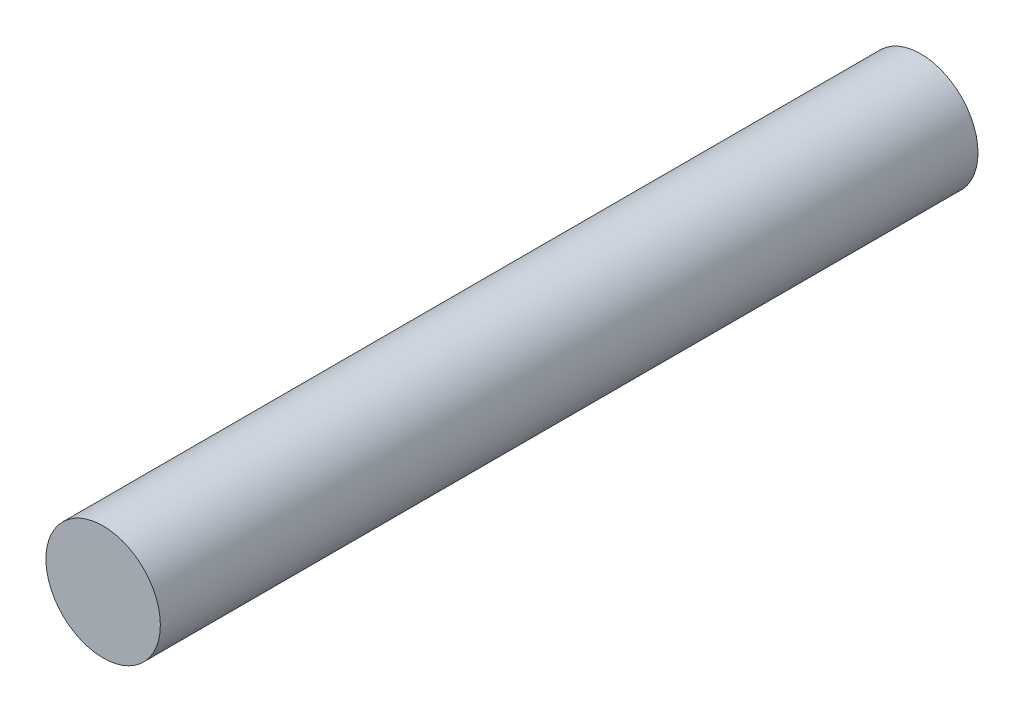
ISO-10303-21;
HEADER;
FILE_DESCRIPTION(('STEP AP214'),'2;1');
FILE_NAME('part.step','',(''),(''),'','','');
FILE_SCHEMA(('AUTOMOTIVE_DESIGN { 1 0 10303 214 1 1 1 1 }'));
ENDSEC;
DATA;
#1=APPLICATION_CONTEXT('core data for automotive mechanical design processes');
#2=APPLICATION_PROTOCOL_DEFINITION('international standard','automotive_design',2000,#1);
#3=PRODUCT_CONTEXT('',#1,'mechanical');
#4=PRODUCT('Part','Part','',(#3));
#5=PRODUCT_RELATED_PRODUCT_CATEGORY('part','',(#4));
#6=PRODUCT_DEFINITION_FORMATION('','',#4);
#7=PRODUCT_DEFINITION_CONTEXT('part definition',#1,'design');
#8=PRODUCT_DEFINITION('design','',#6,#7);
#9=PRODUCT_DEFINITION_SHAPE('','',#8);
#10=(LENGTH_UNIT() NAMED_UNIT(*) SI_UNIT(.MILLI.,.METRE.));
#11=(NAMED_UNIT(*) PLANE_ANGLE_UNIT() SI_UNIT($,.RADIAN.));
#12=(NAMED_UNIT(*) SI_UNIT($,.STERADIAN.) SOLID_ANGLE_UNIT());
#13=UNCERTAINTY_MEASURE_WITH_UNIT(LENGTH_MEASURE(1.E-05),#10,'distance_accuracy_value','');
#14=(GEOMETRIC_REPRESENTATION_CONTEXT(3) GLOBAL_UNCERTAINTY_ASSIGNED_CONTEXT((#13)) GLOBAL_UNIT_ASSIGNED_CONTEXT((#10,
#11,#12)) REPRESENTATION_CONTEXT('',''));
#15=CARTESIAN_POINT('',(0.,0.,0.));
#16=DIRECTION('',(0.,0.,1.));
#17=DIRECTION('',(1.,0.,0.));
#18=AXIS2_PLACEMENT_3D('',#15,#16,#17);
#19=CARTESIAN_POINT('',(0.,0.,25.));
#20=DIRECTION('',(0.,0.,-1.));
#21=DIRECTION('',(-1.,0.,0.));
#22=AXIS2_PLACEMENT_3D('',#19,#20,#21);
#23=CYLINDRICAL_SURFACE('',#22,1.75);
#24=CARTESIAN_POINT('',(0.,0.,25.));
#25=DIRECTION('',(0.,0.,1.));
#26=DIRECTION('',(1.,0.,0.));
#27=AXIS2_PLACEMENT_3D('',#24,#25,#26);
#28=CIRCLE('',#27,1.75);
#29=CARTESIAN_POINT('',(1.75,0.,25.));
#30=VERTEX_POINT('',#29);
#31=EDGE_CURVE('E10',#30,#30,#28,.T.);
#32=ORIENTED_EDGE('',*,*,#31,.F.);
#33=EDGE_LOOP('',(#32));
#34=FACE_BOUND('',#33,.T.);
#35=CARTESIAN_POINT('',(0.,0.,0.));
#36=DIRECTION('',(0.,0.,1.));
#37=DIRECTION('',(1.,0.,0.));
#38=AXIS2_PLACEMENT_3D('',#35,#36,#37);
#39=CIRCLE('',#38,1.75);
#40=CARTESIAN_POINT('',(1.75,0.,0.));
#41=VERTEX_POINT('',#40);
#42=EDGE_CURVE('E38',#41,#41,#39,.T.);
#43=ORIENTED_EDGE('',*,*,#42,.T.);
#44=EDGE_LOOP('',(#43));
#45=FACE_BOUND('',#44,.T.);
#46=ADVANCED_FACE('F35',(#34,#45),#23,.T.);
#47=CARTESIAN_POINT('',(0.,0.,25.));
#48=DIRECTION('',(0.,0.,1.));
#49=DIRECTION('',(1.,0.,0.));
#50=AXIS2_PLACEMENT_3D('',#47,#48,#49);
#51=PLANE('',#50);
#52=ORIENTED_EDGE('',*,*,#31,.T.);
#53=EDGE_LOOP('',(#52));
#54=FACE_BOUND('',#53,.T.);
#55=ADVANCED_FACE('F50',(#54),#51,.T.);
#56=CARTESIAN_POINT('',(0.,0.,0.));
#57=DIRECTION('',(0.,0.,1.));
#58=DIRECTION('',(1.,0.,0.));
#59=AXIS2_PLACEMENT_3D('',#56,#57,#58);
#60=PLANE('',#59);
#61=ORIENTED_EDGE('',*,*,#42,.F.);
#62=EDGE_LOOP('',(#61));
#63=FACE_BOUND('',#62,.T.);
#64=ADVANCED_FACE('F48',(#63),#60,.F.);
#65=CLOSED_SHELL('',(#46,#55,#64));
#66=MANIFOLD_SOLID_BREP('B2',#65);
#67=ADVANCED_BREP_SHAPE_REPRESENTATION('',(#18,#66),#14);
#68=SHAPE_DEFINITION_REPRESENTATION(#9,#67);
ENDSEC;
END-ISO-10303-21;
